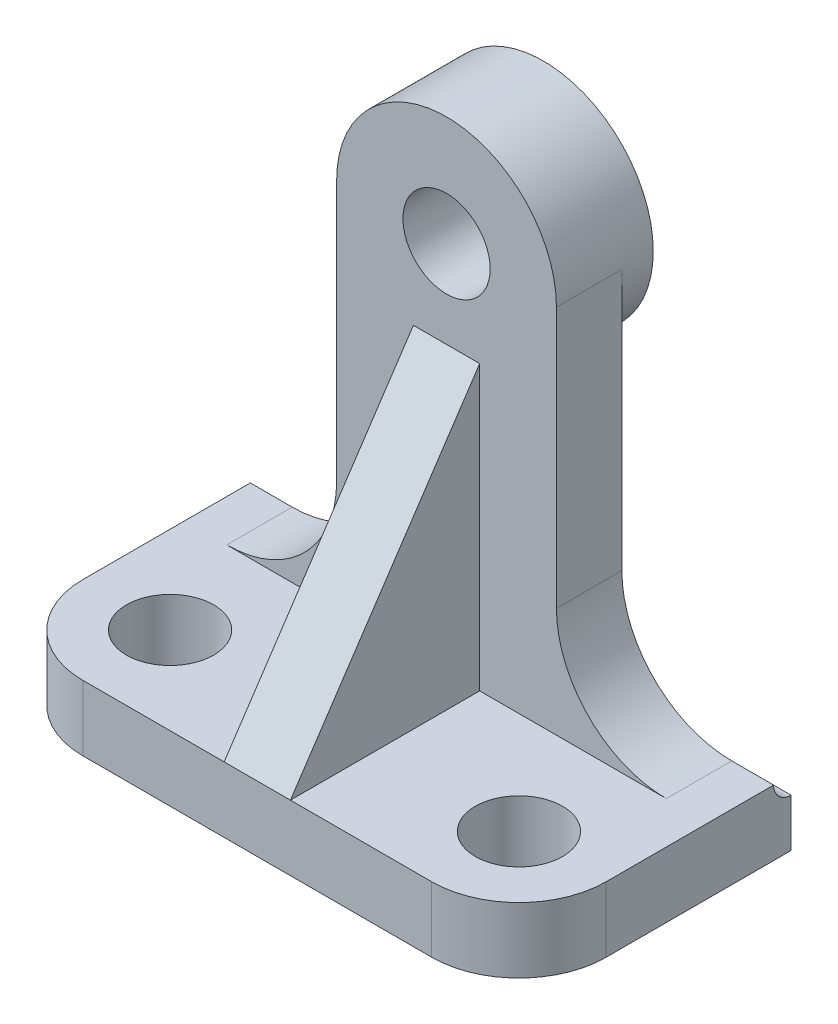
ISO-10303-21;
HEADER;
FILE_DESCRIPTION(('STEP AP214'),'2;1');
FILE_NAME('part.step','',(''),(''),'','','');
FILE_SCHEMA(('AUTOMOTIVE_DESIGN { 1 0 10303 214 1 1 1 1 }'));
ENDSEC;
DATA;
#1=APPLICATION_CONTEXT('core data for automotive mechanical design processes');
#2=APPLICATION_PROTOCOL_DEFINITION('international standard','automotive_design',2000,#1);
#3=PRODUCT_CONTEXT('',#1,'mechanical');
#4=PRODUCT('Part','Part','',(#3));
#5=PRODUCT_RELATED_PRODUCT_CATEGORY('part','',(#4));
#6=PRODUCT_DEFINITION_FORMATION('','',#4);
#7=PRODUCT_DEFINITION_CONTEXT('part definition',#1,'design');
#8=PRODUCT_DEFINITION('design','',#6,#7);
#9=PRODUCT_DEFINITION_SHAPE('','',#8);
#10=(LENGTH_UNIT() NAMED_UNIT(*) SI_UNIT(.MILLI.,.METRE.));
#11=(NAMED_UNIT(*) PLANE_ANGLE_UNIT() SI_UNIT($,.RADIAN.));
#12=(NAMED_UNIT(*) SI_UNIT($,.STERADIAN.) SOLID_ANGLE_UNIT());
#13=UNCERTAINTY_MEASURE_WITH_UNIT(LENGTH_MEASURE(1.E-05),#10,'distance_accuracy_value','');
#14=(GEOMETRIC_REPRESENTATION_CONTEXT(3) GLOBAL_UNCERTAINTY_ASSIGNED_CONTEXT((#13)) GLOBAL_UNIT_ASSIGNED_CONTEXT((#10,
#11,#12)) REPRESENTATION_CONTEXT('',''));
#15=CARTESIAN_POINT('',(0.,0.,0.));
#16=DIRECTION('',(0.,0.,1.));
#17=DIRECTION('',(1.,0.,0.));
#18=AXIS2_PLACEMENT_3D('',#15,#16,#17);
#19=CARTESIAN_POINT('',(-38.1,4.7625,39.624));
#20=DIRECTION('',(0.,-1.,0.));
#21=DIRECTION('',(0.,0.,-1.));
#22=AXIS2_PLACEMENT_3D('',#19,#20,#21);
#23=PLANE('',#22);
#24=DIRECTION('',(1.,0.,0.));
#25=VECTOR('',#24,1.);
#26=CARTESIAN_POINT('',(-16.002,4.7625,12.065));
#27=LINE('',#26,#25);
#28=CARTESIAN_POINT('',(4.826,4.7625,12.065));
#29=VERTEX_POINT('',#28);
#30=CARTESIAN_POINT('',(32.004,4.7625,12.065));
#31=VERTEX_POINT('',#30);
#32=EDGE_CURVE('E160',#29,#31,#27,.T.);
#33=ORIENTED_EDGE('',*,*,#32,.F.);
#34=DIRECTION('',(0.,0.,-1.));
#35=VECTOR('',#34,1.);
#36=CARTESIAN_POINT('',(4.826,4.7625,39.624));
#37=LINE('',#36,#35);
#38=CARTESIAN_POINT('',(4.82599999999998,4.7625,39.624));
#39=VERTEX_POINT('',#38);
#40=EDGE_CURVE('E58',#39,#29,#37,.T.);
#41=ORIENTED_EDGE('',*,*,#40,.F.);
#42=DIRECTION('',(-1.,0.,0.));
#43=VECTOR('',#42,1.);
#44=CARTESIAN_POINT('',(-38.1,4.7625,39.624));
#45=LINE('',#44,#43);
#46=CARTESIAN_POINT('',(25.4,4.7625,39.624));
#47=VERTEX_POINT('',#46);
#48=EDGE_CURVE('E218',#47,#39,#45,.T.);
#49=ORIENTED_EDGE('',*,*,#48,.F.);
#50=CARTESIAN_POINT('',(25.4,4.7625,26.924));
#51=DIRECTION('',(0.,-1.,0.));
#52=DIRECTION('',(0.,0.,-1.));
#53=AXIS2_PLACEMENT_3D('',#50,#51,#52);
#54=CIRCLE('',#53,12.7);
#55=CARTESIAN_POINT('',(38.1,4.7625,26.924));
#56=VERTEX_POINT('',#55);
#57=EDGE_CURVE('E253',#47,#56,#54,.F.);
#58=ORIENTED_EDGE('',*,*,#57,.T.);
#59=DIRECTION('',(0.,0.,-1.));
#60=VECTOR('',#59,1.);
#61=CARTESIAN_POINT('',(38.1,4.7625,39.624));
#62=LINE('',#61,#60);
#63=CARTESIAN_POINT('',(38.1,4.7625,2.54));
#64=VERTEX_POINT('',#63);
#65=EDGE_CURVE('E238',#56,#64,#62,.T.);
#66=ORIENTED_EDGE('',*,*,#65,.T.);
#67=DIRECTION('',(1.,0.,0.));
#68=VECTOR('',#67,1.);
#69=CARTESIAN_POINT('',(-38.1,4.7625,2.54));
#70=LINE('',#69,#68);
#71=CARTESIAN_POINT('',(32.004,4.7625,2.54));
#72=VERTEX_POINT('',#71);
#73=EDGE_CURVE('E214',#64,#72,#70,.F.);
#74=ORIENTED_EDGE('',*,*,#73,.T.);
#75=DIRECTION('',(0.,0.,1.));
#76=VECTOR('',#75,1.);
#77=CARTESIAN_POINT('',(32.004,4.7625,39.624));
#78=LINE('',#77,#76);
#79=EDGE_CURVE('E269',#72,#31,#78,.T.);
#80=ORIENTED_EDGE('',*,*,#79,.T.);
#81=EDGE_LOOP('',(#33,#41,#49,#58,#66,#74,#80));
#82=FACE_BOUND('',#81,.T.);
#83=CARTESIAN_POINT('',(25.4,4.7625,26.924));
#84=DIRECTION('',(0.,1.,0.));
#85=DIRECTION('',(0.,0.,1.));
#86=AXIS2_PLACEMENT_3D('',#83,#84,#85);
#87=CIRCLE('',#86,6.35);
#88=CARTESIAN_POINT('',(25.4,4.7625,33.274));
#89=VERTEX_POINT('',#88);
#90=EDGE_CURVE('E501',#89,#89,#87,.T.);
#91=ORIENTED_EDGE('',*,*,#90,.F.);
#92=EDGE_LOOP('',(#91));
#93=FACE_BOUND('',#92,.T.);
#94=ADVANCED_FACE('F35',(#82,#93),#23,.F.);
#95=CARTESIAN_POINT('',(-25.4,4.7625,26.924));
#96=DIRECTION('',(0.,1.,0.));
#97=DIRECTION('',(0.,0.,1.));
#98=AXIS2_PLACEMENT_3D('',#95,#96,#97);
#99=CIRCLE('',#98,6.35);
#100=CARTESIAN_POINT('',(-25.4,4.7625,33.274));
#101=VERTEX_POINT('',#100);
#102=EDGE_CURVE('E507',#101,#101,#99,.T.);
#103=ORIENTED_EDGE('',*,*,#102,.F.);
#104=EDGE_LOOP('',(#103));
#105=FACE_BOUND('',#104,.T.);
#106=DIRECTION('',(0.,0.,-1.));
#107=VECTOR('',#106,1.);
#108=CARTESIAN_POINT('',(-4.826,4.7625,39.624));
#109=LINE('',#108,#107);
#110=CARTESIAN_POINT('',(-4.82600000000001,4.7625,39.624));
#111=VERTEX_POINT('',#110);
#112=CARTESIAN_POINT('',(-4.826,4.7625,12.065));
#113=VERTEX_POINT('',#112);
#114=EDGE_CURVE('E163',#111,#113,#109,.T.);
#115=ORIENTED_EDGE('',*,*,#114,.T.);
#116=CARTESIAN_POINT('',(-32.004,4.7625,12.065));
#117=VERTEX_POINT('',#116);
#118=EDGE_CURVE('E150',#117,#113,#27,.T.);
#119=ORIENTED_EDGE('',*,*,#118,.F.);
#120=DIRECTION('',(0.,0.,1.));
#121=VECTOR('',#120,1.);
#122=CARTESIAN_POINT('',(-32.004,4.7625,2.54));
#123=LINE('',#122,#121);
#124=CARTESIAN_POINT('',(-32.004,4.7625,2.54));
#125=VERTEX_POINT('',#124);
#126=EDGE_CURVE('E264',#117,#125,#123,.F.);
#127=ORIENTED_EDGE('',*,*,#126,.T.);
#128=CARTESIAN_POINT('',(-38.1,4.7625,2.54));
#129=VERTEX_POINT('',#128);
#130=EDGE_CURVE('E212',#125,#129,#70,.F.);
#131=ORIENTED_EDGE('',*,*,#130,.T.);
#132=DIRECTION('',(0.,0.,-1.));
#133=VECTOR('',#132,1.);
#134=CARTESIAN_POINT('',(-38.1,4.7625,39.624));
#135=LINE('',#134,#133);
#136=CARTESIAN_POINT('',(-38.1,4.7625,26.924));
#137=VERTEX_POINT('',#136);
#138=EDGE_CURVE('E235',#137,#129,#135,.T.);
#139=ORIENTED_EDGE('',*,*,#138,.F.);
#140=CARTESIAN_POINT('',(-25.4,4.7625,26.924));
#141=DIRECTION('',(0.,-1.,0.));
#142=DIRECTION('',(0.,0.,-1.));
#143=AXIS2_PLACEMENT_3D('',#140,#141,#142);
#144=CIRCLE('',#143,12.7);
#145=CARTESIAN_POINT('',(-25.4,4.7625,39.624));
#146=VERTEX_POINT('',#145);
#147=EDGE_CURVE('E255',#137,#146,#144,.F.);
#148=ORIENTED_EDGE('',*,*,#147,.T.);
#149=EDGE_CURVE('E50',#111,#146,#45,.T.);
#150=ORIENTED_EDGE('',*,*,#149,.F.);
#151=EDGE_LOOP('',(#115,#119,#127,#131,#139,#148,#150));
#152=FACE_BOUND('',#151,.T.);
#153=ADVANCED_FACE('F164',(#105,#152),#23,.F.);
#154=CARTESIAN_POINT('',(38.1,-4.7625,39.624));
#155=DIRECTION('',(-1.,0.,0.));
#156=DIRECTION('',(0.,0.,1.));
#157=AXIS2_PLACEMENT_3D('',#154,#155,#156);
#158=PLANE('',#157);
#159=DIRECTION('',(0.,1.,0.));
#160=VECTOR('',#159,1.);
#161=CARTESIAN_POINT('',(38.1,-4.7625,0.));
#162=LINE('',#161,#160);
#163=CARTESIAN_POINT('',(38.1,-4.7625,0.));
#164=VERTEX_POINT('',#163);
#165=CARTESIAN_POINT('',(38.1,2.2225,0.));
#166=VERTEX_POINT('',#165);
#167=EDGE_CURVE('E217',#164,#166,#162,.T.);
#168=ORIENTED_EDGE('',*,*,#167,.T.);
#169=CARTESIAN_POINT('',(38.1,4.7625,0.));
#170=DIRECTION('',(1.,0.,0.));
#171=DIRECTION('',(0.,0.,-1.));
#172=AXIS2_PLACEMENT_3D('',#169,#170,#171);
#173=CIRCLE('',#172,2.54);
#174=EDGE_CURVE('E208',#64,#166,#173,.T.);
#175=ORIENTED_EDGE('',*,*,#174,.F.);
#176=ORIENTED_EDGE('',*,*,#65,.F.);
#177=DIRECTION('',(0.,1.,0.));
#178=VECTOR('',#177,1.);
#179=CARTESIAN_POINT('',(38.1,-4.7625,26.924));
#180=LINE('',#179,#178);
#181=CARTESIAN_POINT('',(38.1,-4.7625,26.924));
#182=VERTEX_POINT('',#181);
#183=EDGE_CURVE('E257',#56,#182,#180,.F.);
#184=ORIENTED_EDGE('',*,*,#183,.T.);
#185=DIRECTION('',(0.,0.,-1.));
#186=VECTOR('',#185,1.);
#187=CARTESIAN_POINT('',(38.1,-4.7625,39.624));
#188=LINE('',#187,#186);
#189=EDGE_CURVE('E223',#182,#164,#188,.T.);
#190=ORIENTED_EDGE('',*,*,#189,.T.);
#191=EDGE_LOOP('',(#168,#175,#176,#184,#190));
#192=FACE_BOUND('',#191,.T.);
#193=ADVANCED_FACE('F325',(#192),#158,.F.);
#194=CARTESIAN_POINT('',(-38.1,-4.7625,39.624));
#195=DIRECTION('',(1.,0.,0.));
#196=DIRECTION('',(0.,0.,-1.));
#197=AXIS2_PLACEMENT_3D('',#194,#195,#196);
#198=PLANE('',#197);
#199=ORIENTED_EDGE('',*,*,#138,.T.);
#200=CARTESIAN_POINT('',(-38.1,4.7625,0.));
#201=DIRECTION('',(1.,0.,0.));
#202=DIRECTION('',(0.,0.,-1.));
#203=AXIS2_PLACEMENT_3D('',#200,#201,#202);
#204=CIRCLE('',#203,2.54);
#205=CARTESIAN_POINT('',(-38.1,2.2225,0.));
#206=VERTEX_POINT('',#205);
#207=EDGE_CURVE('E209',#129,#206,#204,.T.);
#208=ORIENTED_EDGE('',*,*,#207,.T.);
#209=DIRECTION('',(0.,-1.,0.));
#210=VECTOR('',#209,1.);
#211=CARTESIAN_POINT('',(-38.1,-4.7625,0.));
#212=LINE('',#211,#210);
#213=CARTESIAN_POINT('',(-38.1,-4.7625,0.));
#214=VERTEX_POINT('',#213);
#215=EDGE_CURVE('E226',#206,#214,#212,.T.);
#216=ORIENTED_EDGE('',*,*,#215,.T.);
#217=DIRECTION('',(0.,0.,-1.));
#218=VECTOR('',#217,1.);
#219=CARTESIAN_POINT('',(-38.1,-4.7625,39.624));
#220=LINE('',#219,#218);
#221=CARTESIAN_POINT('',(-38.1,-4.7625,26.924));
#222=VERTEX_POINT('',#221);
#223=EDGE_CURVE('E232',#222,#214,#220,.T.);
#224=ORIENTED_EDGE('',*,*,#223,.F.);
#225=DIRECTION('',(0.,-1.,0.));
#226=VECTOR('',#225,1.);
#227=CARTESIAN_POINT('',(-38.1,-4.7625,26.924));
#228=LINE('',#227,#226);
#229=EDGE_CURVE('E251',#222,#137,#228,.F.);
#230=ORIENTED_EDGE('',*,*,#229,.T.);
#231=EDGE_LOOP('',(#199,#208,#216,#224,#230));
#232=FACE_BOUND('',#231,.T.);
#233=ADVANCED_FACE('F303',(#232),#198,.F.);
#234=CARTESIAN_POINT('',(-38.1,-4.7625,39.624));
#235=DIRECTION('',(0.,1.,0.));
#236=DIRECTION('',(0.,0.,1.));
#237=AXIS2_PLACEMENT_3D('',#234,#235,#236);
#238=PLANE('',#237);
#239=CARTESIAN_POINT('',(-25.4,-4.7625,26.924));
#240=DIRECTION('',(0.,1.,0.));
#241=DIRECTION('',(0.,0.,1.));
#242=AXIS2_PLACEMENT_3D('',#239,#240,#241);
#243=CIRCLE('',#242,6.35);
#244=CARTESIAN_POINT('',(-25.4,-4.7625,33.274));
#245=VERTEX_POINT('',#244);
#246=EDGE_CURVE('E504',#245,#245,#243,.T.);
#247=ORIENTED_EDGE('',*,*,#246,.T.);
#248=EDGE_LOOP('',(#247));
#249=FACE_BOUND('',#248,.T.);
#250=CARTESIAN_POINT('',(25.4,-4.7625,26.924));
#251=DIRECTION('',(0.,1.,0.));
#252=DIRECTION('',(0.,0.,1.));
#253=AXIS2_PLACEMENT_3D('',#250,#251,#252);
#254=CIRCLE('',#253,6.35);
#255=CARTESIAN_POINT('',(25.4,-4.7625,33.274));
#256=VERTEX_POINT('',#255);
#257=EDGE_CURVE('E491',#256,#256,#254,.T.);
#258=ORIENTED_EDGE('',*,*,#257,.T.);
#259=EDGE_LOOP('',(#258));
#260=FACE_BOUND('',#259,.T.);
#261=DIRECTION('',(1.,0.,0.));
#262=VECTOR('',#261,1.);
#263=CARTESIAN_POINT('',(-38.1,-4.7625,39.624));
#264=LINE('',#263,#262);
#265=CARTESIAN_POINT('',(-25.4,-4.7625,39.624));
#266=VERTEX_POINT('',#265);
#267=CARTESIAN_POINT('',(25.4,-4.7625,39.624));
#268=VERTEX_POINT('',#267);
#269=EDGE_CURVE('E220',#266,#268,#264,.T.);
#270=ORIENTED_EDGE('',*,*,#269,.F.);
#271=CARTESIAN_POINT('',(-25.4,-4.7625,26.924));
#272=DIRECTION('',(0.,1.,0.));
#273=DIRECTION('',(0.,0.,1.));
#274=AXIS2_PLACEMENT_3D('',#271,#272,#273);
#275=CIRCLE('',#274,12.7);
#276=EDGE_CURVE('E249',#266,#222,#275,.F.);
#277=ORIENTED_EDGE('',*,*,#276,.T.);
#278=ORIENTED_EDGE('',*,*,#223,.T.);
#279=DIRECTION('',(1.,0.,0.));
#280=VECTOR('',#279,1.);
#281=CARTESIAN_POINT('',(-38.1,-4.7625,0.));
#282=LINE('',#281,#280);
#283=EDGE_CURVE('E228',#214,#164,#282,.T.);
#284=ORIENTED_EDGE('',*,*,#283,.T.);
#285=ORIENTED_EDGE('',*,*,#189,.F.);
#286=CARTESIAN_POINT('',(25.4,-4.7625,26.924));
#287=DIRECTION('',(0.,1.,0.));
#288=DIRECTION('',(0.,0.,1.));
#289=AXIS2_PLACEMENT_3D('',#286,#287,#288);
#290=CIRCLE('',#289,12.7);
#291=EDGE_CURVE('E247',#182,#268,#290,.F.);
#292=ORIENTED_EDGE('',*,*,#291,.T.);
#293=EDGE_LOOP('',(#270,#277,#278,#284,#285,#292));
#294=FACE_BOUND('',#293,.T.);
#295=ADVANCED_FACE('F315',(#249,#260,#294),#238,.F.);
#296=CARTESIAN_POINT('',(0.,0.,39.624));
#297=DIRECTION('',(0.,0.,-1.));
#298=DIRECTION('',(-1.,0.,0.));
#299=AXIS2_PLACEMENT_3D('',#296,#297,#298);
#300=PLANE('',#299);
#301=ORIENTED_EDGE('',*,*,#48,.T.);
#302=DIRECTION('',(-1.,0.,0.));
#303=VECTOR('',#302,1.);
#304=CARTESIAN_POINT('',(4.826,4.7625,39.624));
#305=LINE('',#304,#303);
#306=EDGE_CURVE('E179',#39,#111,#305,.T.);
#307=ORIENTED_EDGE('',*,*,#306,.T.);
#308=ORIENTED_EDGE('',*,*,#149,.T.);
#309=DIRECTION('',(0.,-1.,0.));
#310=VECTOR('',#309,1.);
#311=CARTESIAN_POINT('',(-25.4,0.,39.624));
#312=LINE('',#311,#310);
#313=EDGE_CURVE('E244',#146,#266,#312,.T.);
#314=ORIENTED_EDGE('',*,*,#313,.T.);
#315=ORIENTED_EDGE('',*,*,#269,.T.);
#316=DIRECTION('',(0.,1.,0.));
#317=VECTOR('',#316,1.);
#318=CARTESIAN_POINT('',(25.4,0.,39.624));
#319=LINE('',#318,#317);
#320=EDGE_CURVE('E241',#268,#47,#319,.T.);
#321=ORIENTED_EDGE('',*,*,#320,.T.);
#322=EDGE_LOOP('',(#301,#307,#308,#314,#315,#321));
#323=FACE_BOUND('',#322,.T.);
#324=ADVANCED_FACE('F312',(#323),#300,.F.);
#325=CARTESIAN_POINT('',(0.,0.,0.));
#326=DIRECTION('',(0.,0.,-1.));
#327=DIRECTION('',(-1.,0.,0.));
#328=AXIS2_PLACEMENT_3D('',#325,#326,#327);
#329=PLANE('',#328);
#330=DIRECTION('',(1.,0.,0.));
#331=VECTOR('',#330,1.);
#332=CARTESIAN_POINT('',(-38.1,2.2225,0.));
#333=LINE('',#332,#331);
#334=EDGE_CURVE('E259',#166,#206,#333,.F.);
#335=ORIENTED_EDGE('',*,*,#334,.F.);
#336=ORIENTED_EDGE('',*,*,#167,.F.);
#337=ORIENTED_EDGE('',*,*,#283,.F.);
#338=ORIENTED_EDGE('',*,*,#215,.F.);
#339=EDGE_LOOP('',(#335,#336,#337,#338));
#340=FACE_BOUND('',#339,.T.);
#341=ADVANCED_FACE('F328',(#340),#329,.T.);
#342=CARTESIAN_POINT('',(-25.4,0.,26.924));
#343=DIRECTION('',(0.,-1.,0.));
#344=DIRECTION('',(0.,0.,-1.));
#345=AXIS2_PLACEMENT_3D('',#342,#343,#344);
#346=CYLINDRICAL_SURFACE('',#345,12.7);
#347=ORIENTED_EDGE('',*,*,#147,.F.);
#348=ORIENTED_EDGE('',*,*,#229,.F.);
#349=ORIENTED_EDGE('',*,*,#276,.F.);
#350=ORIENTED_EDGE('',*,*,#313,.F.);
#351=EDGE_LOOP('',(#347,#348,#349,#350));
#352=FACE_BOUND('',#351,.T.);
#353=ADVANCED_FACE('F309',(#352),#346,.T.);
#354=CARTESIAN_POINT('',(25.4,0.,26.924));
#355=DIRECTION('',(0.,1.,0.));
#356=DIRECTION('',(0.,0.,1.));
#357=AXIS2_PLACEMENT_3D('',#354,#355,#356);
#358=CYLINDRICAL_SURFACE('',#357,12.7);
#359=ORIENTED_EDGE('',*,*,#291,.F.);
#360=ORIENTED_EDGE('',*,*,#183,.F.);
#361=ORIENTED_EDGE('',*,*,#57,.F.);
#362=ORIENTED_EDGE('',*,*,#320,.F.);
#363=EDGE_LOOP('',(#359,#360,#361,#362));
#364=FACE_BOUND('',#363,.T.);
#365=ADVANCED_FACE('F320',(#364),#358,.T.);
#366=CARTESIAN_POINT('',(-38.1,4.7625,0.));
#367=DIRECTION('',(1.,0.,0.));
#368=DIRECTION('',(0.,0.,-1.));
#369=AXIS2_PLACEMENT_3D('',#366,#367,#368);
#370=CYLINDRICAL_SURFACE('',#369,2.54);
#371=ORIENTED_EDGE('',*,*,#174,.T.);
#372=ORIENTED_EDGE('',*,*,#334,.T.);
#373=ORIENTED_EDGE('',*,*,#207,.F.);
#374=ORIENTED_EDGE('',*,*,#130,.F.);
#375=DIRECTION('',(1.,0.,0.));
#376=VECTOR('',#375,1.);
#377=CARTESIAN_POINT('',(-16.002,4.7625,2.54));
#378=LINE('',#377,#376);
#379=EDGE_CURVE('E159',#125,#72,#378,.T.);
#380=ORIENTED_EDGE('',*,*,#379,.T.);
#381=ORIENTED_EDGE('',*,*,#73,.F.);
#382=EDGE_LOOP('',(#371,#372,#373,#374,#380,#381));
#383=FACE_BOUND('',#382,.T.);
#384=ADVANCED_FACE('F299',(#383),#370,.F.);
#385=CARTESIAN_POINT('',(-16.002,58.7375,2.54));
#386=DIRECTION('',(1.,0.,0.));
#387=DIRECTION('',(0.,0.,-1.));
#388=AXIS2_PLACEMENT_3D('',#385,#386,#387);
#389=PLANE('',#388);
#390=DIRECTION('',(0.,-1.,0.));
#391=VECTOR('',#390,1.);
#392=CARTESIAN_POINT('',(-16.002,58.7375,2.54));
#393=LINE('',#392,#391);
#394=CARTESIAN_POINT('',(-16.002,58.7375,2.54));
#395=VERTEX_POINT('',#394);
#396=CARTESIAN_POINT('',(-16.002,20.7645,2.54));
#397=VERTEX_POINT('',#396);
#398=EDGE_CURVE('E195',#395,#397,#393,.T.);
#399=ORIENTED_EDGE('',*,*,#398,.T.);
#400=DIRECTION('',(0.,0.,1.));
#401=VECTOR('',#400,1.);
#402=CARTESIAN_POINT('',(-16.002,20.7645,12.065));
#403=LINE('',#402,#401);
#404=CARTESIAN_POINT('',(-16.002,20.7645,12.065));
#405=VERTEX_POINT('',#404);
#406=EDGE_CURVE('E261',#397,#405,#403,.T.);
#407=ORIENTED_EDGE('',*,*,#406,.T.);
#408=DIRECTION('',(0.,-1.,0.));
#409=VECTOR('',#408,1.);
#410=CARTESIAN_POINT('',(-16.002,58.7375,12.065));
#411=LINE('',#410,#409);
#412=CARTESIAN_POINT('',(-16.002,58.7375,12.065));
#413=VERTEX_POINT('',#412);
#414=EDGE_CURVE('E206',#413,#405,#411,.T.);
#415=ORIENTED_EDGE('',*,*,#414,.F.);
#416=DIRECTION('',(0.,0.,1.));
#417=VECTOR('',#416,1.);
#418=CARTESIAN_POINT('',(-16.002,58.7375,2.54));
#419=LINE('',#418,#417);
#420=EDGE_CURVE('E191',#395,#413,#419,.T.);
#421=ORIENTED_EDGE('',*,*,#420,.F.);
#422=EDGE_LOOP('',(#399,#407,#415,#421));
#423=FACE_BOUND('',#422,.T.);
#424=ADVANCED_FACE('F290',(#423),#389,.F.);
#425=CARTESIAN_POINT('',(-16.002,58.7375,12.065));
#426=DIRECTION('',(0.,0.,-1.));
#427=DIRECTION('',(-1.,0.,0.));
#428=AXIS2_PLACEMENT_3D('',#425,#426,#427);
#429=PLANE('',#428);
#430=CARTESIAN_POINT('',(0.,58.7375,12.065));
#431=DIRECTION('',(0.,0.,1.));
#432=DIRECTION('',(1.,0.,0.));
#433=AXIS2_PLACEMENT_3D('',#430,#431,#432);
#434=CIRCLE('',#433,6.35);
#435=CARTESIAN_POINT('',(6.35,58.7375,12.065));
#436=VERTEX_POINT('',#435);
#437=EDGE_CURVE('E488',#436,#436,#434,.T.);
#438=ORIENTED_EDGE('',*,*,#437,.F.);
#439=EDGE_LOOP('',(#438));
#440=FACE_BOUND('',#439,.T.);
#441=DIRECTION('',(-1.,0.,0.));
#442=VECTOR('',#441,1.);
#443=CARTESIAN_POINT('',(4.826,46.0375,12.065));
#444=LINE('',#443,#442);
#445=CARTESIAN_POINT('',(4.826,46.0375,12.065));
#446=VERTEX_POINT('',#445);
#447=CARTESIAN_POINT('',(-4.826,46.0375,12.065));
#448=VERTEX_POINT('',#447);
#449=EDGE_CURVE('E177',#446,#448,#444,.T.);
#450=ORIENTED_EDGE('',*,*,#449,.F.);
#451=DIRECTION('',(0.,1.,0.));
#452=VECTOR('',#451,1.);
#453=CARTESIAN_POINT('',(4.826,4.7625,12.065));
#454=LINE('',#453,#452);
#455=EDGE_CURVE('E180',#29,#446,#454,.T.);
#456=ORIENTED_EDGE('',*,*,#455,.F.);
#457=ORIENTED_EDGE('',*,*,#32,.T.);
#458=CARTESIAN_POINT('',(32.004,20.7645,12.065));
#459=DIRECTION('',(0.,0.,-1.));
#460=DIRECTION('',(-1.,0.,0.));
#461=AXIS2_PLACEMENT_3D('',#458,#459,#460);
#462=CIRCLE('',#461,16.002);
#463=CARTESIAN_POINT('',(16.002,20.7645,12.065));
#464=VERTEX_POINT('',#463);
#465=EDGE_CURVE('E43',#31,#464,#462,.T.);
#466=ORIENTED_EDGE('',*,*,#465,.T.);
#467=DIRECTION('',(0.,-1.,0.));
#468=VECTOR('',#467,1.);
#469=CARTESIAN_POINT('',(16.002,58.7375,12.065));
#470=LINE('',#469,#468);
#471=CARTESIAN_POINT('',(16.002,58.7375,12.065));
#472=VERTEX_POINT('',#471);
#473=EDGE_CURVE('E203',#472,#464,#470,.T.);
#474=ORIENTED_EDGE('',*,*,#473,.F.);
#475=CARTESIAN_POINT('',(0.,58.7375,12.065));
#476=DIRECTION('',(0.,0.,1.));
#477=DIRECTION('',(1.,0.,0.));
#478=AXIS2_PLACEMENT_3D('',#475,#476,#477);
#479=CIRCLE('',#478,16.002);
#480=EDGE_CURVE('E182',#472,#413,#479,.T.);
#481=ORIENTED_EDGE('',*,*,#480,.T.);
#482=ORIENTED_EDGE('',*,*,#414,.T.);
#483=CARTESIAN_POINT('',(-32.004,20.7645,12.065));
#484=DIRECTION('',(0.,0.,-1.));
#485=DIRECTION('',(-1.,0.,0.));
#486=AXIS2_PLACEMENT_3D('',#483,#484,#485);
#487=CIRCLE('',#486,16.002);
#488=EDGE_CURVE('E156',#405,#117,#487,.T.);
#489=ORIENTED_EDGE('',*,*,#488,.T.);
#490=ORIENTED_EDGE('',*,*,#118,.T.);
#491=DIRECTION('',(0.,1.,0.));
#492=VECTOR('',#491,1.);
#493=CARTESIAN_POINT('',(-4.826,4.7625,12.065));
#494=LINE('',#493,#492);
#495=EDGE_CURVE('E153',#113,#448,#494,.T.);
#496=ORIENTED_EDGE('',*,*,#495,.T.);
#497=EDGE_LOOP('',(#450,#456,#457,#466,#474,#481,#482,#489,#490,#496));
#498=FACE_BOUND('',#497,.T.);
#499=ADVANCED_FACE('F151',(#440,#498),#429,.F.);
#500=CARTESIAN_POINT('',(16.002,58.7375,2.54));
#501=DIRECTION('',(1.,0.,0.));
#502=DIRECTION('',(0.,0.,-1.));
#503=AXIS2_PLACEMENT_3D('',#500,#501,#502);
#504=PLANE('',#503);
#505=ORIENTED_EDGE('',*,*,#473,.T.);
#506=DIRECTION('',(0.,0.,1.));
#507=VECTOR('',#506,1.);
#508=CARTESIAN_POINT('',(16.002,20.7645,2.54));
#509=LINE('',#508,#507);
#510=CARTESIAN_POINT('',(16.002,20.7645,2.54));
#511=VERTEX_POINT('',#510);
#512=EDGE_CURVE('E272',#464,#511,#509,.F.);
#513=ORIENTED_EDGE('',*,*,#512,.T.);
#514=DIRECTION('',(0.,-1.,0.));
#515=VECTOR('',#514,1.);
#516=CARTESIAN_POINT('',(16.002,58.7375,2.54));
#517=LINE('',#516,#515);
#518=CARTESIAN_POINT('',(16.002,58.7375,2.54));
#519=VERTEX_POINT('',#518);
#520=EDGE_CURVE('E200',#519,#511,#517,.T.);
#521=ORIENTED_EDGE('',*,*,#520,.F.);
#522=DIRECTION('',(0.,0.,1.));
#523=VECTOR('',#522,1.);
#524=CARTESIAN_POINT('',(16.002,58.7375,2.54));
#525=LINE('',#524,#523);
#526=EDGE_CURVE('E194',#519,#472,#525,.T.);
#527=ORIENTED_EDGE('',*,*,#526,.T.);
#528=EDGE_LOOP('',(#505,#513,#521,#527));
#529=FACE_BOUND('',#528,.T.);
#530=ADVANCED_FACE('F280',(#529),#504,.T.);
#531=CARTESIAN_POINT('',(-16.002,58.7375,2.54));
#532=DIRECTION('',(0.,0.,-1.));
#533=DIRECTION('',(-1.,0.,0.));
#534=AXIS2_PLACEMENT_3D('',#531,#532,#533);
#535=PLANE('',#534);
#536=CARTESIAN_POINT('',(0.,58.7375,2.54));
#537=DIRECTION('',(0.,0.,-1.));
#538=DIRECTION('',(-1.,0.,0.));
#539=AXIS2_PLACEMENT_3D('',#536,#537,#538);
#540=CIRCLE('',#539,16.002);
#541=EDGE_CURVE('E186',#519,#395,#540,.T.);
#542=ORIENTED_EDGE('',*,*,#541,.F.);
#543=ORIENTED_EDGE('',*,*,#520,.T.);
#544=CARTESIAN_POINT('',(32.004,20.7645,2.53999999999999));
#545=DIRECTION('',(0.,0.,-1.));
#546=DIRECTION('',(-1.,0.,0.));
#547=AXIS2_PLACEMENT_3D('',#544,#545,#546);
#548=CIRCLE('',#547,16.002);
#549=EDGE_CURVE('E11',#511,#72,#548,.F.);
#550=ORIENTED_EDGE('',*,*,#549,.T.);
#551=ORIENTED_EDGE('',*,*,#379,.F.);
#552=CARTESIAN_POINT('',(-32.004,20.7645,2.54));
#553=DIRECTION('',(0.,0.,-1.));
#554=DIRECTION('',(-1.,0.,0.));
#555=AXIS2_PLACEMENT_3D('',#552,#553,#554);
#556=CIRCLE('',#555,16.002);
#557=EDGE_CURVE('E267',#125,#397,#556,.F.);
#558=ORIENTED_EDGE('',*,*,#557,.T.);
#559=ORIENTED_EDGE('',*,*,#398,.F.);
#560=EDGE_LOOP('',(#542,#543,#550,#551,#558,#559));
#561=FACE_BOUND('',#560,.T.);
#562=ADVANCED_FACE('F285',(#561),#535,.T.);
#563=CARTESIAN_POINT('',(-32.004,20.7645,2.54));
#564=DIRECTION('',(0.,0.,-1.));
#565=DIRECTION('',(-1.,0.,0.));
#566=AXIS2_PLACEMENT_3D('',#563,#564,#565);
#567=CYLINDRICAL_SURFACE('',#566,16.002);
#568=ORIENTED_EDGE('',*,*,#557,.F.);
#569=ORIENTED_EDGE('',*,*,#126,.F.);
#570=ORIENTED_EDGE('',*,*,#488,.F.);
#571=ORIENTED_EDGE('',*,*,#406,.F.);
#572=EDGE_LOOP('',(#568,#569,#570,#571));
#573=FACE_BOUND('',#572,.T.);
#574=ADVANCED_FACE('F294',(#573),#567,.F.);
#575=CARTESIAN_POINT('',(32.004,20.7645,39.624));
#576=DIRECTION('',(0.,0.,1.));
#577=DIRECTION('',(1.,0.,0.));
#578=AXIS2_PLACEMENT_3D('',#575,#576,#577);
#579=CYLINDRICAL_SURFACE('',#578,16.002);
#580=ORIENTED_EDGE('',*,*,#549,.F.);
#581=ORIENTED_EDGE('',*,*,#512,.F.);
#582=ORIENTED_EDGE('',*,*,#465,.F.);
#583=ORIENTED_EDGE('',*,*,#79,.F.);
#584=EDGE_LOOP('',(#580,#581,#582,#583));
#585=FACE_BOUND('',#584,.T.);
#586=ADVANCED_FACE('F37',(#585),#579,.F.);
#587=CARTESIAN_POINT('',(0.,58.7375,-2.03200000000001));
#588=DIRECTION('',(0.,0.,1.));
#589=DIRECTION('',(1.,0.,0.));
#590=AXIS2_PLACEMENT_3D('',#587,#588,#589);
#591=CYLINDRICAL_SURFACE('',#590,16.002);
#592=CARTESIAN_POINT('',(0.,58.7375,-2.03200000000001));
#593=DIRECTION('',(0.,0.,1.));
#594=DIRECTION('',(1.,0.,0.));
#595=AXIS2_PLACEMENT_3D('',#592,#593,#594);
#596=CIRCLE('',#595,16.002);
#597=CARTESIAN_POINT('',(16.002,58.7375,-2.03200000000001));
#598=VERTEX_POINT('',#597);
#599=EDGE_CURVE('E183',#598,#598,#596,.T.);
#600=ORIENTED_EDGE('',*,*,#599,.T.);
#601=EDGE_LOOP('',(#600));
#602=FACE_BOUND('',#601,.T.);
#603=ORIENTED_EDGE('',*,*,#541,.T.);
#604=ORIENTED_EDGE('',*,*,#420,.T.);
#605=ORIENTED_EDGE('',*,*,#480,.F.);
#606=ORIENTED_EDGE('',*,*,#526,.F.);
#607=EDGE_LOOP('',(#603,#604,#605,#606));
#608=FACE_BOUND('',#607,.T.);
#609=ADVANCED_FACE('F287',(#602,#608),#591,.T.);
#610=CARTESIAN_POINT('',(0.,58.7375,-2.03200000000001));
#611=DIRECTION('',(0.,0.,1.));
#612=DIRECTION('',(1.,0.,0.));
#613=AXIS2_PLACEMENT_3D('',#610,#611,#612);
#614=PLANE('',#613);
#615=CARTESIAN_POINT('',(0.,58.7375,-2.03200000000001));
#616=DIRECTION('',(0.,0.,1.));
#617=DIRECTION('',(1.,0.,0.));
#618=AXIS2_PLACEMENT_3D('',#615,#616,#617);
#619=CIRCLE('',#618,6.35);
#620=CARTESIAN_POINT('',(6.35,58.7375,-2.03200000000001));
#621=VERTEX_POINT('',#620);
#622=EDGE_CURVE('E486',#621,#621,#619,.T.);
#623=ORIENTED_EDGE('',*,*,#622,.T.);
#624=EDGE_LOOP('',(#623));
#625=FACE_BOUND('',#624,.T.);
#626=ORIENTED_EDGE('',*,*,#599,.F.);
#627=EDGE_LOOP('',(#626));
#628=FACE_BOUND('',#627,.T.);
#629=ADVANCED_FACE('F404',(#625,#628),#614,.F.);
#630=CARTESIAN_POINT('',(4.826,46.0375,12.065));
#631=DIRECTION('',(0.,-0.555290581777434,-0.831656401279566));
#632=DIRECTION('',(0.,0.831656401279566,-0.555290581777434));
#633=AXIS2_PLACEMENT_3D('',#630,#631,#632);
#634=PLANE('',#633);
#635=DIRECTION('',(0.,-0.831656401279566,0.555290581777434));
#636=VECTOR('',#635,1.);
#637=CARTESIAN_POINT('',(-4.826,46.0375,12.065));
#638=LINE('',#637,#636);
#639=EDGE_CURVE('E168',#448,#111,#638,.T.);
#640=ORIENTED_EDGE('',*,*,#639,.T.);
#641=ORIENTED_EDGE('',*,*,#306,.F.);
#642=DIRECTION('',(0.,-0.831656401279566,0.555290581777434));
#643=VECTOR('',#642,1.);
#644=CARTESIAN_POINT('',(4.826,46.0375,12.065));
#645=LINE('',#644,#643);
#646=EDGE_CURVE('E171',#446,#39,#645,.T.);
#647=ORIENTED_EDGE('',*,*,#646,.F.);
#648=ORIENTED_EDGE('',*,*,#449,.T.);
#649=EDGE_LOOP('',(#640,#641,#647,#648));
#650=FACE_BOUND('',#649,.T.);
#651=ADVANCED_FACE('F420',(#650),#634,.F.);
#652=CARTESIAN_POINT('',(4.826,0.,0.));
#653=DIRECTION('',(1.,0.,0.));
#654=DIRECTION('',(0.,0.,-1.));
#655=AXIS2_PLACEMENT_3D('',#652,#653,#654);
#656=PLANE('',#655);
#657=ORIENTED_EDGE('',*,*,#646,.T.);
#658=ORIENTED_EDGE('',*,*,#40,.T.);
#659=ORIENTED_EDGE('',*,*,#455,.T.);
#660=EDGE_LOOP('',(#657,#658,#659));
#661=FACE_BOUND('',#660,.T.);
#662=ADVANCED_FACE('F425',(#661),#656,.T.);
#663=CARTESIAN_POINT('',(-4.826,0.,0.));
#664=DIRECTION('',(1.,0.,0.));
#665=DIRECTION('',(0.,0.,-1.));
#666=AXIS2_PLACEMENT_3D('',#663,#664,#665);
#667=PLANE('',#666);
#668=ORIENTED_EDGE('',*,*,#639,.F.);
#669=ORIENTED_EDGE('',*,*,#495,.F.);
#670=ORIENTED_EDGE('',*,*,#114,.F.);
#671=EDGE_LOOP('',(#668,#669,#670));
#672=FACE_BOUND('',#671,.T.);
#673=ADVANCED_FACE('F170',(#672),#667,.F.);
#674=CARTESIAN_POINT('',(0.,58.7375,-2.03200000000001));
#675=DIRECTION('',(0.,0.,1.));
#676=DIRECTION('',(1.,0.,0.));
#677=AXIS2_PLACEMENT_3D('',#674,#675,#676);
#678=CYLINDRICAL_SURFACE('',#677,6.35);
#679=ORIENTED_EDGE('',*,*,#622,.F.);
#680=EDGE_LOOP('',(#679));
#681=FACE_BOUND('',#680,.T.);
#682=ORIENTED_EDGE('',*,*,#437,.T.);
#683=EDGE_LOOP('',(#682));
#684=FACE_BOUND('',#683,.T.);
#685=ADVANCED_FACE('F443',(#681,#684),#678,.F.);
#686=CARTESIAN_POINT('',(25.4,4.7625,26.924));
#687=DIRECTION('',(0.,1.,0.));
#688=DIRECTION('',(0.,0.,1.));
#689=AXIS2_PLACEMENT_3D('',#686,#687,#688);
#690=CYLINDRICAL_SURFACE('',#689,6.35);
#691=ORIENTED_EDGE('',*,*,#257,.F.);
#692=EDGE_LOOP('',(#691));
#693=FACE_BOUND('',#692,.T.);
#694=ORIENTED_EDGE('',*,*,#90,.T.);
#695=EDGE_LOOP('',(#694));
#696=FACE_BOUND('',#695,.T.);
#697=ADVANCED_FACE('F452',(#693,#696),#690,.F.);
#698=CARTESIAN_POINT('',(-25.4,4.7625,26.924));
#699=DIRECTION('',(0.,1.,0.));
#700=DIRECTION('',(0.,0.,1.));
#701=AXIS2_PLACEMENT_3D('',#698,#699,#700);
#702=CYLINDRICAL_SURFACE('',#701,6.35);
#703=ORIENTED_EDGE('',*,*,#246,.F.);
#704=EDGE_LOOP('',(#703));
#705=FACE_BOUND('',#704,.T.);
#706=ORIENTED_EDGE('',*,*,#102,.T.);
#707=EDGE_LOOP('',(#706));
#708=FACE_BOUND('',#707,.T.);
#709=ADVANCED_FACE('F464',(#705,#708),#702,.F.);
#710=CLOSED_SHELL('',(#94,#153,#193,#233,#295,#324,#341,#353,#365,#384,#424,#499,#530,#562,#574,
#586,#609,#629,#651,#662,#673,#685,#697,#709));
#711=MANIFOLD_SOLID_BREP('B2',#710);
#712=ADVANCED_BREP_SHAPE_REPRESENTATION('',(#18,#711),#14);
#713=SHAPE_DEFINITION_REPRESENTATION(#9,#712);
ENDSEC;
END-ISO-10303-21;
